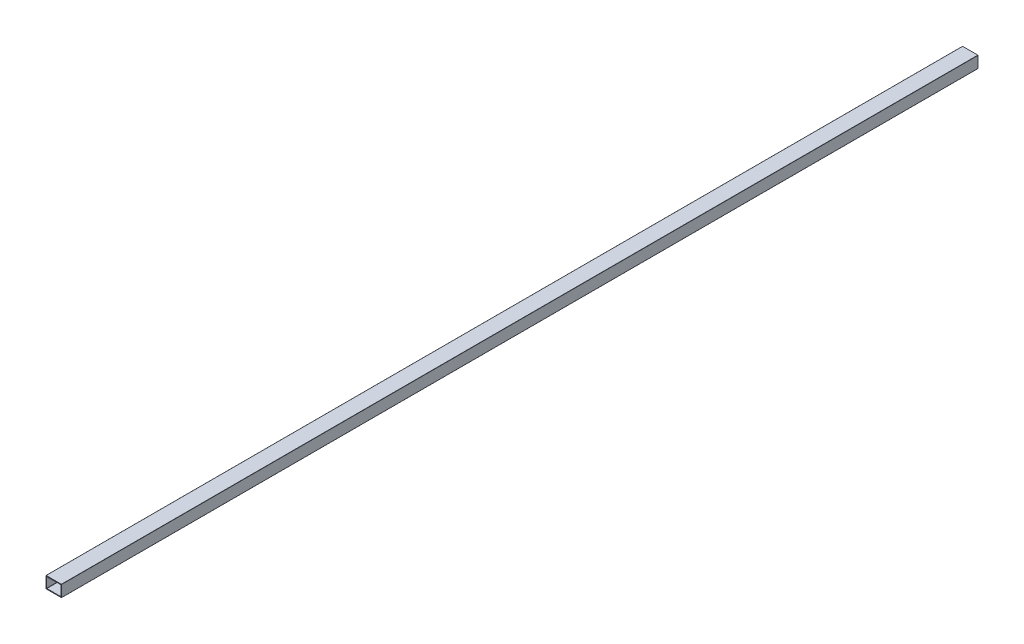
ISO-10303-21;
HEADER;
FILE_DESCRIPTION(('STEP AP214'),'2;1');
FILE_NAME('part.step','',(''),(''),'','','');
FILE_SCHEMA(('AUTOMOTIVE_DESIGN { 1 0 10303 214 1 1 1 1 }'));
ENDSEC;
DATA;
#1=APPLICATION_CONTEXT('core data for automotive mechanical design processes');
#2=APPLICATION_PROTOCOL_DEFINITION('international standard','automotive_design',2000,#1);
#3=PRODUCT_CONTEXT('',#1,'mechanical');
#4=PRODUCT('Part','Part','',(#3));
#5=PRODUCT_RELATED_PRODUCT_CATEGORY('part','',(#4));
#6=PRODUCT_DEFINITION_FORMATION('','',#4);
#7=PRODUCT_DEFINITION_CONTEXT('part definition',#1,'design');
#8=PRODUCT_DEFINITION('design','',#6,#7);
#9=PRODUCT_DEFINITION_SHAPE('','',#8);
#10=(LENGTH_UNIT() NAMED_UNIT(*) SI_UNIT(.MILLI.,.METRE.));
#11=(NAMED_UNIT(*) PLANE_ANGLE_UNIT() SI_UNIT($,.RADIAN.));
#12=(NAMED_UNIT(*) SI_UNIT($,.STERADIAN.) SOLID_ANGLE_UNIT());
#13=UNCERTAINTY_MEASURE_WITH_UNIT(LENGTH_MEASURE(1.E-05),#10,'distance_accuracy_value','');
#14=(GEOMETRIC_REPRESENTATION_CONTEXT(3) GLOBAL_UNCERTAINTY_ASSIGNED_CONTEXT((#13)) GLOBAL_UNIT_ASSIGNED_CONTEXT((#10,
#11,#12)) REPRESENTATION_CONTEXT('',''));
#15=CARTESIAN_POINT('',(0.,0.,0.));
#16=DIRECTION('',(0.,0.,1.));
#17=DIRECTION('',(1.,0.,0.));
#18=AXIS2_PLACEMENT_3D('',#15,#16,#17);
#19=CARTESIAN_POINT('',(50.8,-38.1,-6000.));
#20=DIRECTION('',(1.,0.,0.));
#21=DIRECTION('',(0.,0.,-1.));
#22=AXIS2_PLACEMENT_3D('',#19,#20,#21);
#23=PLANE('',#22);
#24=DIRECTION('',(0.,1.,0.));
#25=VECTOR('',#24,1.);
#26=CARTESIAN_POINT('',(50.8,-38.1,0.));
#27=LINE('',#26,#25);
#28=CARTESIAN_POINT('',(50.8,-37.1,0.));
#29=VERTEX_POINT('',#28);
#30=CARTESIAN_POINT('',(50.8,37.1,0.));
#31=VERTEX_POINT('',#30);
#32=EDGE_CURVE('E197',#29,#31,#27,.T.);
#33=ORIENTED_EDGE('',*,*,#32,.F.);
#34=DIRECTION('',(0.,0.,1.));
#35=VECTOR('',#34,1.);
#36=CARTESIAN_POINT('',(50.8,-37.1,-6000.));
#37=LINE('',#36,#35);
#38=CARTESIAN_POINT('',(50.8,-37.1,-6000.));
#39=VERTEX_POINT('',#38);
#40=EDGE_CURVE('E158',#29,#39,#37,.F.);
#41=ORIENTED_EDGE('',*,*,#40,.T.);
#42=DIRECTION('',(0.,1.,0.));
#43=VECTOR('',#42,1.);
#44=CARTESIAN_POINT('',(50.8,-38.1,-6000.));
#45=LINE('',#44,#43);
#46=CARTESIAN_POINT('',(50.8,37.1,-6000.));
#47=VERTEX_POINT('',#46);
#48=EDGE_CURVE('E185',#39,#47,#45,.T.);
#49=ORIENTED_EDGE('',*,*,#48,.T.);
#50=DIRECTION('',(0.,0.,1.));
#51=VECTOR('',#50,1.);
#52=CARTESIAN_POINT('',(50.8,37.1,-6000.));
#53=LINE('',#52,#51);
#54=EDGE_CURVE('E251',#47,#31,#53,.T.);
#55=ORIENTED_EDGE('',*,*,#54,.T.);
#56=EDGE_LOOP('',(#33,#41,#49,#55));
#57=FACE_BOUND('',#56,.T.);
#58=ADVANCED_FACE('F33',(#57),#23,.T.);
#59=CARTESIAN_POINT('',(-50.8,-38.1,-6000.));
#60=DIRECTION('',(0.,-1.,0.));
#61=DIRECTION('',(0.,0.,-1.));
#62=AXIS2_PLACEMENT_3D('',#59,#60,#61);
#63=PLANE('',#62);
#64=DIRECTION('',(1.,0.,0.));
#65=VECTOR('',#64,1.);
#66=CARTESIAN_POINT('',(-50.8,-38.1,0.));
#67=LINE('',#66,#65);
#68=CARTESIAN_POINT('',(-49.8,-38.1,0.));
#69=VERTEX_POINT('',#68);
#70=CARTESIAN_POINT('',(49.8,-38.1,0.));
#71=VERTEX_POINT('',#70);
#72=EDGE_CURVE('E189',#69,#71,#67,.T.);
#73=ORIENTED_EDGE('',*,*,#72,.F.);
#74=DIRECTION('',(0.,0.,1.));
#75=VECTOR('',#74,1.);
#76=CARTESIAN_POINT('',(-49.8,-38.1,-6000.));
#77=LINE('',#76,#75);
#78=CARTESIAN_POINT('',(-49.8,-38.1,-6000.));
#79=VERTEX_POINT('',#78);
#80=EDGE_CURVE('E238',#69,#79,#77,.F.);
#81=ORIENTED_EDGE('',*,*,#80,.T.);
#82=DIRECTION('',(1.,0.,0.));
#83=VECTOR('',#82,1.);
#84=CARTESIAN_POINT('',(-50.8,-38.1,-6000.));
#85=LINE('',#84,#83);
#86=CARTESIAN_POINT('',(49.8,-38.1,-6000.));
#87=VERTEX_POINT('',#86);
#88=EDGE_CURVE('E194',#79,#87,#85,.T.);
#89=ORIENTED_EDGE('',*,*,#88,.T.);
#90=DIRECTION('',(0.,0.,1.));
#91=VECTOR('',#90,1.);
#92=CARTESIAN_POINT('',(49.8,-38.1,-6000.));
#93=LINE('',#92,#91);
#94=EDGE_CURVE('E235',#87,#71,#93,.T.);
#95=ORIENTED_EDGE('',*,*,#94,.T.);
#96=EDGE_LOOP('',(#73,#81,#89,#95));
#97=FACE_BOUND('',#96,.T.);
#98=ADVANCED_FACE('F305',(#97),#63,.T.);
#99=CARTESIAN_POINT('',(-50.8,-38.1,-6000.));
#100=DIRECTION('',(-1.,0.,0.));
#101=DIRECTION('',(0.,0.,1.));
#102=AXIS2_PLACEMENT_3D('',#99,#100,#101);
#103=PLANE('',#102);
#104=DIRECTION('',(0.,-1.,0.));
#105=VECTOR('',#104,1.);
#106=CARTESIAN_POINT('',(-50.8,-38.1,-6000.));
#107=LINE('',#106,#105);
#108=CARTESIAN_POINT('',(-50.8,37.1,-6000.));
#109=VERTEX_POINT('',#108);
#110=CARTESIAN_POINT('',(-50.8,-37.1,-6000.));
#111=VERTEX_POINT('',#110);
#112=EDGE_CURVE('E191',#109,#111,#107,.T.);
#113=ORIENTED_EDGE('',*,*,#112,.T.);
#114=DIRECTION('',(0.,0.,1.));
#115=VECTOR('',#114,1.);
#116=CARTESIAN_POINT('',(-50.8,-37.1,-6000.));
#117=LINE('',#116,#115);
#118=CARTESIAN_POINT('',(-50.8,-37.1,0.));
#119=VERTEX_POINT('',#118);
#120=EDGE_CURVE('E224',#111,#119,#117,.T.);
#121=ORIENTED_EDGE('',*,*,#120,.T.);
#122=DIRECTION('',(0.,-1.,0.));
#123=VECTOR('',#122,1.);
#124=CARTESIAN_POINT('',(-50.8,-38.1,0.));
#125=LINE('',#124,#123);
#126=CARTESIAN_POINT('',(-50.8,37.1,0.));
#127=VERTEX_POINT('',#126);
#128=EDGE_CURVE('E203',#127,#119,#125,.T.);
#129=ORIENTED_EDGE('',*,*,#128,.F.);
#130=DIRECTION('',(0.,0.,1.));
#131=VECTOR('',#130,1.);
#132=CARTESIAN_POINT('',(-50.8,37.1,-6000.));
#133=LINE('',#132,#131);
#134=EDGE_CURVE('E222',#127,#109,#133,.F.);
#135=ORIENTED_EDGE('',*,*,#134,.T.);
#136=EDGE_LOOP('',(#113,#121,#129,#135));
#137=FACE_BOUND('',#136,.T.);
#138=ADVANCED_FACE('F311',(#137),#103,.T.);
#139=CARTESIAN_POINT('',(-50.8,38.1,-6000.));
#140=DIRECTION('',(0.,1.,0.));
#141=DIRECTION('',(0.,0.,1.));
#142=AXIS2_PLACEMENT_3D('',#139,#140,#141);
#143=PLANE('',#142);
#144=DIRECTION('',(-1.,0.,0.));
#145=VECTOR('',#144,1.);
#146=CARTESIAN_POINT('',(-50.8,38.1,-6000.));
#147=LINE('',#146,#145);
#148=CARTESIAN_POINT('',(49.8,38.1,-6000.));
#149=VERTEX_POINT('',#148);
#150=CARTESIAN_POINT('',(-49.8,38.1,-6000.));
#151=VERTEX_POINT('',#150);
#152=EDGE_CURVE('E188',#149,#151,#147,.T.);
#153=ORIENTED_EDGE('',*,*,#152,.T.);
#154=DIRECTION('',(0.,0.,1.));
#155=VECTOR('',#154,1.);
#156=CARTESIAN_POINT('',(-49.8,38.1,-6000.));
#157=LINE('',#156,#155);
#158=CARTESIAN_POINT('',(-49.8,38.1,0.));
#159=VERTEX_POINT('',#158);
#160=EDGE_CURVE('E248',#151,#159,#157,.T.);
#161=ORIENTED_EDGE('',*,*,#160,.T.);
#162=DIRECTION('',(-1.,0.,0.));
#163=VECTOR('',#162,1.);
#164=CARTESIAN_POINT('',(-50.8,38.1,0.));
#165=LINE('',#164,#163);
#166=CARTESIAN_POINT('',(49.8,38.1,0.));
#167=VERTEX_POINT('',#166);
#168=EDGE_CURVE('E200',#167,#159,#165,.T.);
#169=ORIENTED_EDGE('',*,*,#168,.F.);
#170=DIRECTION('',(0.,0.,1.));
#171=VECTOR('',#170,1.);
#172=CARTESIAN_POINT('',(49.8,38.1,-6000.));
#173=LINE('',#172,#171);
#174=EDGE_CURVE('E55',#167,#149,#173,.F.);
#175=ORIENTED_EDGE('',*,*,#174,.T.);
#176=EDGE_LOOP('',(#153,#161,#169,#175));
#177=FACE_BOUND('',#176,.T.);
#178=ADVANCED_FACE('F316',(#177),#143,.T.);
#179=CARTESIAN_POINT('',(0.,0.,-6000.));
#180=DIRECTION('',(0.,0.,-1.));
#181=DIRECTION('',(-1.,0.,0.));
#182=AXIS2_PLACEMENT_3D('',#179,#180,#181);
#183=PLANE('',#182);
#184=DIRECTION('',(0.,-1.,0.));
#185=VECTOR('',#184,1.);
#186=CARTESIAN_POINT('',(-46.25,-33.55,-6000.));
#187=LINE('',#186,#185);
#188=CARTESIAN_POINT('',(-46.25,32.55,-6000.));
#189=VERTEX_POINT('',#188);
#190=CARTESIAN_POINT('',(-46.25,-32.55,-6000.));
#191=VERTEX_POINT('',#190);
#192=EDGE_CURVE('E167',#189,#191,#187,.T.);
#193=ORIENTED_EDGE('',*,*,#192,.T.);
#194=CARTESIAN_POINT('',(-45.25,-32.55,-6000.));
#195=DIRECTION('',(0.,0.,-1.));
#196=DIRECTION('',(-1.,0.,0.));
#197=AXIS2_PLACEMENT_3D('',#194,#195,#196);
#198=CIRCLE('',#197,1.);
#199=CARTESIAN_POINT('',(-45.25,-33.55,-6000.));
#200=VERTEX_POINT('',#199);
#201=EDGE_CURVE('E11',#191,#200,#198,.F.);
#202=ORIENTED_EDGE('',*,*,#201,.T.);
#203=DIRECTION('',(1.,0.,0.));
#204=VECTOR('',#203,1.);
#205=CARTESIAN_POINT('',(-46.25,-33.55,-6000.));
#206=LINE('',#205,#204);
#207=CARTESIAN_POINT('',(45.25,-33.55,-6000.));
#208=VERTEX_POINT('',#207);
#209=EDGE_CURVE('E175',#200,#208,#206,.T.);
#210=ORIENTED_EDGE('',*,*,#209,.T.);
#211=CARTESIAN_POINT('',(45.25,-32.55,-6000.));
#212=DIRECTION('',(0.,0.,-1.));
#213=DIRECTION('',(-1.,0.,0.));
#214=AXIS2_PLACEMENT_3D('',#211,#212,#213);
#215=CIRCLE('',#214,1.);
#216=CARTESIAN_POINT('',(46.25,-32.55,-6000.));
#217=VERTEX_POINT('',#216);
#218=EDGE_CURVE('E262',#208,#217,#215,.F.);
#219=ORIENTED_EDGE('',*,*,#218,.T.);
#220=DIRECTION('',(0.,1.,0.));
#221=VECTOR('',#220,1.);
#222=CARTESIAN_POINT('',(46.25,-33.55,-6000.));
#223=LINE('',#222,#221);
#224=CARTESIAN_POINT('',(46.25,32.55,-6000.));
#225=VERTEX_POINT('',#224);
#226=EDGE_CURVE('E179',#217,#225,#223,.T.);
#227=ORIENTED_EDGE('',*,*,#226,.T.);
#228=CARTESIAN_POINT('',(45.25,32.55,-6000.));
#229=DIRECTION('',(0.,0.,-1.));
#230=DIRECTION('',(-1.,0.,0.));
#231=AXIS2_PLACEMENT_3D('',#228,#229,#230);
#232=CIRCLE('',#231,1.);
#233=CARTESIAN_POINT('',(45.25,33.55,-6000.));
#234=VERTEX_POINT('',#233);
#235=EDGE_CURVE('E258',#225,#234,#232,.F.);
#236=ORIENTED_EDGE('',*,*,#235,.T.);
#237=DIRECTION('',(-1.,0.,0.));
#238=VECTOR('',#237,1.);
#239=CARTESIAN_POINT('',(-46.25,33.55,-6000.));
#240=LINE('',#239,#238);
#241=CARTESIAN_POINT('',(-45.25,33.55,-6000.));
#242=VERTEX_POINT('',#241);
#243=EDGE_CURVE('E277',#234,#242,#240,.T.);
#244=ORIENTED_EDGE('',*,*,#243,.T.);
#245=CARTESIAN_POINT('',(-45.25,32.55,-6000.));
#246=DIRECTION('',(0.,0.,-1.));
#247=DIRECTION('',(-1.,0.,0.));
#248=AXIS2_PLACEMENT_3D('',#245,#246,#247);
#249=CIRCLE('',#248,1.);
#250=EDGE_CURVE('E157',#242,#189,#249,.F.);
#251=ORIENTED_EDGE('',*,*,#250,.T.);
#252=EDGE_LOOP('',(#193,#202,#210,#219,#227,#236,#244,#251));
#253=FACE_BOUND('',#252,.T.);
#254=ORIENTED_EDGE('',*,*,#88,.F.);
#255=CARTESIAN_POINT('',(-49.8,-37.1,-6000.));
#256=DIRECTION('',(0.,0.,-1.));
#257=DIRECTION('',(-1.,0.,0.));
#258=AXIS2_PLACEMENT_3D('',#255,#256,#257);
#259=CIRCLE('',#258,1.);
#260=EDGE_CURVE('E245',#79,#111,#259,.T.);
#261=ORIENTED_EDGE('',*,*,#260,.T.);
#262=ORIENTED_EDGE('',*,*,#112,.F.);
#263=CARTESIAN_POINT('',(-49.8,37.1,-6000.));
#264=DIRECTION('',(0.,0.,-1.));
#265=DIRECTION('',(-1.,0.,0.));
#266=AXIS2_PLACEMENT_3D('',#263,#264,#265);
#267=CIRCLE('',#266,1.);
#268=EDGE_CURVE('E48',#109,#151,#267,.T.);
#269=ORIENTED_EDGE('',*,*,#268,.T.);
#270=ORIENTED_EDGE('',*,*,#152,.F.);
#271=CARTESIAN_POINT('',(49.8,37.1,-6000.));
#272=DIRECTION('',(0.,0.,-1.));
#273=DIRECTION('',(-1.,0.,0.));
#274=AXIS2_PLACEMENT_3D('',#271,#272,#273);
#275=CIRCLE('',#274,1.);
#276=EDGE_CURVE('E240',#149,#47,#275,.T.);
#277=ORIENTED_EDGE('',*,*,#276,.T.);
#278=ORIENTED_EDGE('',*,*,#48,.F.);
#279=CARTESIAN_POINT('',(49.8,-37.1,-6000.));
#280=DIRECTION('',(0.,0.,-1.));
#281=DIRECTION('',(-1.,0.,0.));
#282=AXIS2_PLACEMENT_3D('',#279,#280,#281);
#283=CIRCLE('',#282,1.);
#284=EDGE_CURVE('E242',#39,#87,#283,.T.);
#285=ORIENTED_EDGE('',*,*,#284,.T.);
#286=EDGE_LOOP('',(#254,#261,#262,#269,#270,#277,#278,#285));
#287=FACE_BOUND('',#286,.T.);
#288=ADVANCED_FACE('F267',(#253,#287),#183,.T.);
#289=CARTESIAN_POINT('',(0.,0.,0.));
#290=DIRECTION('',(0.,0.,-1.));
#291=DIRECTION('',(-1.,0.,0.));
#292=AXIS2_PLACEMENT_3D('',#289,#290,#291);
#293=PLANE('',#292);
#294=DIRECTION('',(0.,1.,0.));
#295=VECTOR('',#294,1.);
#296=CARTESIAN_POINT('',(46.25,-33.55,0.));
#297=LINE('',#296,#295);
#298=CARTESIAN_POINT('',(46.25,-32.55,0.));
#299=VERTEX_POINT('',#298);
#300=CARTESIAN_POINT('',(46.25,32.55,0.));
#301=VERTEX_POINT('',#300);
#302=EDGE_CURVE('E181',#299,#301,#297,.T.);
#303=ORIENTED_EDGE('',*,*,#302,.F.);
#304=CARTESIAN_POINT('',(45.25,-32.55,0.));
#305=DIRECTION('',(0.,0.,-1.));
#306=DIRECTION('',(-1.,0.,0.));
#307=AXIS2_PLACEMENT_3D('',#304,#305,#306);
#308=CIRCLE('',#307,1.);
#309=CARTESIAN_POINT('',(45.25,-33.55,0.));
#310=VERTEX_POINT('',#309);
#311=EDGE_CURVE('E260',#299,#310,#308,.T.);
#312=ORIENTED_EDGE('',*,*,#311,.T.);
#313=DIRECTION('',(1.,0.,0.));
#314=VECTOR('',#313,1.);
#315=CARTESIAN_POINT('',(-46.25,-33.55,0.));
#316=LINE('',#315,#314);
#317=CARTESIAN_POINT('',(-45.25,-33.55,0.));
#318=VERTEX_POINT('',#317);
#319=EDGE_CURVE('E281',#318,#310,#316,.T.);
#320=ORIENTED_EDGE('',*,*,#319,.F.);
#321=CARTESIAN_POINT('',(-45.25,-32.55,0.));
#322=DIRECTION('',(0.,0.,-1.));
#323=DIRECTION('',(-1.,0.,0.));
#324=AXIS2_PLACEMENT_3D('',#321,#322,#323);
#325=CIRCLE('',#324,1.);
#326=CARTESIAN_POINT('',(-46.25,-32.55,0.));
#327=VERTEX_POINT('',#326);
#328=EDGE_CURVE('E41',#318,#327,#325,.T.);
#329=ORIENTED_EDGE('',*,*,#328,.T.);
#330=DIRECTION('',(0.,-1.,0.));
#331=VECTOR('',#330,1.);
#332=CARTESIAN_POINT('',(-46.25,-33.55,0.));
#333=LINE('',#332,#331);
#334=CARTESIAN_POINT('',(-46.25,32.55,0.));
#335=VERTEX_POINT('',#334);
#336=EDGE_CURVE('E164',#335,#327,#333,.T.);
#337=ORIENTED_EDGE('',*,*,#336,.F.);
#338=CARTESIAN_POINT('',(-45.25,32.55,0.));
#339=DIRECTION('',(0.,0.,-1.));
#340=DIRECTION('',(-1.,0.,0.));
#341=AXIS2_PLACEMENT_3D('',#338,#339,#340);
#342=CIRCLE('',#341,1.);
#343=CARTESIAN_POINT('',(-45.25,33.55,0.));
#344=VERTEX_POINT('',#343);
#345=EDGE_CURVE('E147',#335,#344,#342,.T.);
#346=ORIENTED_EDGE('',*,*,#345,.T.);
#347=DIRECTION('',(-1.,0.,0.));
#348=VECTOR('',#347,1.);
#349=CARTESIAN_POINT('',(-46.25,33.55,0.));
#350=LINE('',#349,#348);
#351=CARTESIAN_POINT('',(45.25,33.55,0.));
#352=VERTEX_POINT('',#351);
#353=EDGE_CURVE('E176',#352,#344,#350,.T.);
#354=ORIENTED_EDGE('',*,*,#353,.F.);
#355=CARTESIAN_POINT('',(45.25,32.55,0.));
#356=DIRECTION('',(0.,0.,-1.));
#357=DIRECTION('',(-1.,0.,0.));
#358=AXIS2_PLACEMENT_3D('',#355,#356,#357);
#359=CIRCLE('',#358,1.);
#360=EDGE_CURVE('E256',#352,#301,#359,.T.);
#361=ORIENTED_EDGE('',*,*,#360,.T.);
#362=EDGE_LOOP('',(#303,#312,#320,#329,#337,#346,#354,#361));
#363=FACE_BOUND('',#362,.T.);
#364=ORIENTED_EDGE('',*,*,#128,.T.);
#365=CARTESIAN_POINT('',(-49.8,-37.1,0.));
#366=DIRECTION('',(0.,0.,-1.));
#367=DIRECTION('',(-1.,0.,0.));
#368=AXIS2_PLACEMENT_3D('',#365,#366,#367);
#369=CIRCLE('',#368,1.);
#370=EDGE_CURVE('E233',#119,#69,#369,.F.);
#371=ORIENTED_EDGE('',*,*,#370,.T.);
#372=ORIENTED_EDGE('',*,*,#72,.T.);
#373=CARTESIAN_POINT('',(49.8,-37.1,0.));
#374=DIRECTION('',(0.,0.,-1.));
#375=DIRECTION('',(-1.,0.,0.));
#376=AXIS2_PLACEMENT_3D('',#373,#374,#375);
#377=CIRCLE('',#376,1.);
#378=EDGE_CURVE('E229',#71,#29,#377,.F.);
#379=ORIENTED_EDGE('',*,*,#378,.T.);
#380=ORIENTED_EDGE('',*,*,#32,.T.);
#381=CARTESIAN_POINT('',(49.8,37.1,0.));
#382=DIRECTION('',(0.,0.,-1.));
#383=DIRECTION('',(-1.,0.,0.));
#384=AXIS2_PLACEMENT_3D('',#381,#382,#383);
#385=CIRCLE('',#384,1.);
#386=EDGE_CURVE('E227',#31,#167,#385,.F.);
#387=ORIENTED_EDGE('',*,*,#386,.T.);
#388=ORIENTED_EDGE('',*,*,#168,.T.);
#389=CARTESIAN_POINT('',(-49.8,37.1,0.));
#390=DIRECTION('',(0.,0.,-1.));
#391=DIRECTION('',(-1.,0.,0.));
#392=AXIS2_PLACEMENT_3D('',#389,#390,#391);
#393=CIRCLE('',#392,1.);
#394=EDGE_CURVE('E231',#159,#127,#393,.F.);
#395=ORIENTED_EDGE('',*,*,#394,.T.);
#396=EDGE_LOOP('',(#364,#371,#372,#379,#380,#387,#388,#395));
#397=FACE_BOUND('',#396,.T.);
#398=ADVANCED_FACE('F172',(#363,#397),#293,.F.);
#399=CARTESIAN_POINT('',(-46.25,-33.55,-6000.));
#400=DIRECTION('',(0.,-1.,0.));
#401=DIRECTION('',(0.,0.,-1.));
#402=AXIS2_PLACEMENT_3D('',#399,#400,#401);
#403=PLANE('',#402);
#404=ORIENTED_EDGE('',*,*,#319,.T.);
#405=DIRECTION('',(0.,0.,1.));
#406=VECTOR('',#405,1.);
#407=CARTESIAN_POINT('',(45.25,-33.55,-6000.));
#408=LINE('',#407,#406);
#409=EDGE_CURVE('E220',#310,#208,#408,.F.);
#410=ORIENTED_EDGE('',*,*,#409,.T.);
#411=ORIENTED_EDGE('',*,*,#209,.F.);
#412=DIRECTION('',(0.,0.,1.));
#413=VECTOR('',#412,1.);
#414=CARTESIAN_POINT('',(-45.25,-33.55,0.));
#415=LINE('',#414,#413);
#416=EDGE_CURVE('E217',#200,#318,#415,.T.);
#417=ORIENTED_EDGE('',*,*,#416,.T.);
#418=EDGE_LOOP('',(#404,#410,#411,#417));
#419=FACE_BOUND('',#418,.T.);
#420=ADVANCED_FACE('F283',(#419),#403,.F.);
#421=CARTESIAN_POINT('',(-46.25,-33.55,-6000.));
#422=DIRECTION('',(-1.,0.,0.));
#423=DIRECTION('',(0.,0.,1.));
#424=AXIS2_PLACEMENT_3D('',#421,#422,#423);
#425=PLANE('',#424);
#426=ORIENTED_EDGE('',*,*,#192,.F.);
#427=DIRECTION('',(0.,0.,1.));
#428=VECTOR('',#427,1.);
#429=CARTESIAN_POINT('',(-46.25,32.55,0.));
#430=LINE('',#429,#428);
#431=EDGE_CURVE('E151',#189,#335,#430,.T.);
#432=ORIENTED_EDGE('',*,*,#431,.T.);
#433=ORIENTED_EDGE('',*,*,#336,.T.);
#434=DIRECTION('',(0.,0.,1.));
#435=VECTOR('',#434,1.);
#436=CARTESIAN_POINT('',(-46.25,-32.55,-6000.));
#437=LINE('',#436,#435);
#438=EDGE_CURVE('E169',#327,#191,#437,.F.);
#439=ORIENTED_EDGE('',*,*,#438,.T.);
#440=EDGE_LOOP('',(#426,#432,#433,#439));
#441=FACE_BOUND('',#440,.T.);
#442=ADVANCED_FACE('F163',(#441),#425,.F.);
#443=CARTESIAN_POINT('',(-46.25,33.55,-6000.));
#444=DIRECTION('',(0.,1.,0.));
#445=DIRECTION('',(0.,0.,1.));
#446=AXIS2_PLACEMENT_3D('',#443,#444,#445);
#447=PLANE('',#446);
#448=ORIENTED_EDGE('',*,*,#353,.T.);
#449=DIRECTION('',(0.,0.,1.));
#450=VECTOR('',#449,1.);
#451=CARTESIAN_POINT('',(-45.25,33.55,-6000.));
#452=LINE('',#451,#450);
#453=EDGE_CURVE('E152',#344,#242,#452,.F.);
#454=ORIENTED_EDGE('',*,*,#453,.T.);
#455=ORIENTED_EDGE('',*,*,#243,.F.);
#456=DIRECTION('',(0.,0.,1.));
#457=VECTOR('',#456,1.);
#458=CARTESIAN_POINT('',(45.25,33.55,0.));
#459=LINE('',#458,#457);
#460=EDGE_CURVE('E168',#234,#352,#459,.T.);
#461=ORIENTED_EDGE('',*,*,#460,.T.);
#462=EDGE_LOOP('',(#448,#454,#455,#461));
#463=FACE_BOUND('',#462,.T.);
#464=ADVANCED_FACE('F292',(#463),#447,.F.);
#465=CARTESIAN_POINT('',(46.25,-33.55,-6000.));
#466=DIRECTION('',(1.,0.,0.));
#467=DIRECTION('',(0.,0.,-1.));
#468=AXIS2_PLACEMENT_3D('',#465,#466,#467);
#469=PLANE('',#468);
#470=ORIENTED_EDGE('',*,*,#302,.T.);
#471=DIRECTION('',(0.,0.,1.));
#472=VECTOR('',#471,1.);
#473=CARTESIAN_POINT('',(46.25,32.55,-6000.));
#474=LINE('',#473,#472);
#475=EDGE_CURVE('E215',#301,#225,#474,.F.);
#476=ORIENTED_EDGE('',*,*,#475,.T.);
#477=ORIENTED_EDGE('',*,*,#226,.F.);
#478=DIRECTION('',(0.,0.,1.));
#479=VECTOR('',#478,1.);
#480=CARTESIAN_POINT('',(46.25,-32.55,0.));
#481=LINE('',#480,#479);
#482=EDGE_CURVE('E212',#217,#299,#481,.T.);
#483=ORIENTED_EDGE('',*,*,#482,.T.);
#484=EDGE_LOOP('',(#470,#476,#477,#483));
#485=FACE_BOUND('',#484,.T.);
#486=ADVANCED_FACE('F275',(#485),#469,.F.);
#487=CARTESIAN_POINT('',(-45.25,32.55,-6000.));
#488=DIRECTION('',(0.,0.,-1.));
#489=DIRECTION('',(-1.,0.,0.));
#490=AXIS2_PLACEMENT_3D('',#487,#488,#489);
#491=CYLINDRICAL_SURFACE('',#490,1.);
#492=ORIENTED_EDGE('',*,*,#250,.F.);
#493=ORIENTED_EDGE('',*,*,#453,.F.);
#494=ORIENTED_EDGE('',*,*,#345,.F.);
#495=ORIENTED_EDGE('',*,*,#431,.F.);
#496=EDGE_LOOP('',(#492,#493,#494,#495));
#497=FACE_BOUND('',#496,.T.);
#498=ADVANCED_FACE('F150',(#497),#491,.F.);
#499=CARTESIAN_POINT('',(45.25,32.55,-6000.));
#500=DIRECTION('',(0.,0.,-1.));
#501=DIRECTION('',(-1.,0.,0.));
#502=AXIS2_PLACEMENT_3D('',#499,#500,#501);
#503=CYLINDRICAL_SURFACE('',#502,1.);
#504=ORIENTED_EDGE('',*,*,#235,.F.);
#505=ORIENTED_EDGE('',*,*,#475,.F.);
#506=ORIENTED_EDGE('',*,*,#360,.F.);
#507=ORIENTED_EDGE('',*,*,#460,.F.);
#508=EDGE_LOOP('',(#504,#505,#506,#507));
#509=FACE_BOUND('',#508,.T.);
#510=ADVANCED_FACE('F294',(#509),#503,.F.);
#511=CARTESIAN_POINT('',(45.25,-32.55,-6000.));
#512=DIRECTION('',(0.,0.,-1.));
#513=DIRECTION('',(-1.,0.,0.));
#514=AXIS2_PLACEMENT_3D('',#511,#512,#513);
#515=CYLINDRICAL_SURFACE('',#514,1.);
#516=ORIENTED_EDGE('',*,*,#218,.F.);
#517=ORIENTED_EDGE('',*,*,#409,.F.);
#518=ORIENTED_EDGE('',*,*,#311,.F.);
#519=ORIENTED_EDGE('',*,*,#482,.F.);
#520=EDGE_LOOP('',(#516,#517,#518,#519));
#521=FACE_BOUND('',#520,.T.);
#522=ADVANCED_FACE('F279',(#521),#515,.F.);
#523=CARTESIAN_POINT('',(-49.8,-37.1,-6000.));
#524=DIRECTION('',(0.,0.,1.));
#525=DIRECTION('',(1.,0.,0.));
#526=AXIS2_PLACEMENT_3D('',#523,#524,#525);
#527=CYLINDRICAL_SURFACE('',#526,1.);
#528=ORIENTED_EDGE('',*,*,#260,.F.);
#529=ORIENTED_EDGE('',*,*,#80,.F.);
#530=ORIENTED_EDGE('',*,*,#370,.F.);
#531=ORIENTED_EDGE('',*,*,#120,.F.);
#532=EDGE_LOOP('',(#528,#529,#530,#531));
#533=FACE_BOUND('',#532,.T.);
#534=ADVANCED_FACE('F301',(#533),#527,.T.);
#535=CARTESIAN_POINT('',(-49.8,37.1,-6000.));
#536=DIRECTION('',(0.,0.,1.));
#537=DIRECTION('',(1.,0.,0.));
#538=AXIS2_PLACEMENT_3D('',#535,#536,#537);
#539=CYLINDRICAL_SURFACE('',#538,1.);
#540=ORIENTED_EDGE('',*,*,#268,.F.);
#541=ORIENTED_EDGE('',*,*,#134,.F.);
#542=ORIENTED_EDGE('',*,*,#394,.F.);
#543=ORIENTED_EDGE('',*,*,#160,.F.);
#544=EDGE_LOOP('',(#540,#541,#542,#543));
#545=FACE_BOUND('',#544,.T.);
#546=ADVANCED_FACE('F368',(#545),#539,.T.);
#547=CARTESIAN_POINT('',(-45.25,-32.55,-6000.));
#548=DIRECTION('',(0.,0.,-1.));
#549=DIRECTION('',(-1.,0.,0.));
#550=AXIS2_PLACEMENT_3D('',#547,#548,#549);
#551=CYLINDRICAL_SURFACE('',#550,1.);
#552=ORIENTED_EDGE('',*,*,#201,.F.);
#553=ORIENTED_EDGE('',*,*,#438,.F.);
#554=ORIENTED_EDGE('',*,*,#328,.F.);
#555=ORIENTED_EDGE('',*,*,#416,.F.);
#556=EDGE_LOOP('',(#552,#553,#554,#555));
#557=FACE_BOUND('',#556,.T.);
#558=ADVANCED_FACE('F378',(#557),#551,.F.);
#559=CARTESIAN_POINT('',(49.8,-37.1,-6000.));
#560=DIRECTION('',(0.,0.,1.));
#561=DIRECTION('',(1.,0.,0.));
#562=AXIS2_PLACEMENT_3D('',#559,#560,#561);
#563=CYLINDRICAL_SURFACE('',#562,1.);
#564=ORIENTED_EDGE('',*,*,#284,.F.);
#565=ORIENTED_EDGE('',*,*,#40,.F.);
#566=ORIENTED_EDGE('',*,*,#378,.F.);
#567=ORIENTED_EDGE('',*,*,#94,.F.);
#568=EDGE_LOOP('',(#564,#565,#566,#567));
#569=FACE_BOUND('',#568,.T.);
#570=ADVANCED_FACE('F388',(#569),#563,.T.);
#571=CARTESIAN_POINT('',(49.8,37.1,-6000.));
#572=DIRECTION('',(0.,0.,1.));
#573=DIRECTION('',(1.,0.,0.));
#574=AXIS2_PLACEMENT_3D('',#571,#572,#573);
#575=CYLINDRICAL_SURFACE('',#574,1.);
#576=ORIENTED_EDGE('',*,*,#276,.F.);
#577=ORIENTED_EDGE('',*,*,#174,.F.);
#578=ORIENTED_EDGE('',*,*,#386,.F.);
#579=ORIENTED_EDGE('',*,*,#54,.F.);
#580=EDGE_LOOP('',(#576,#577,#578,#579));
#581=FACE_BOUND('',#580,.T.);
#582=ADVANCED_FACE('F35',(#581),#575,.T.);
#583=CLOSED_SHELL('',(#58,#98,#138,#178,#288,#398,#420,#442,#464,#486,#498,#510,#522,#534,#546,
#558,#570,#582));
#584=MANIFOLD_SOLID_BREP('B2',#583);
#585=ADVANCED_BREP_SHAPE_REPRESENTATION('',(#18,#584),#14);
#586=SHAPE_DEFINITION_REPRESENTATION(#9,#585);
ENDSEC;
END-ISO-10303-21;
